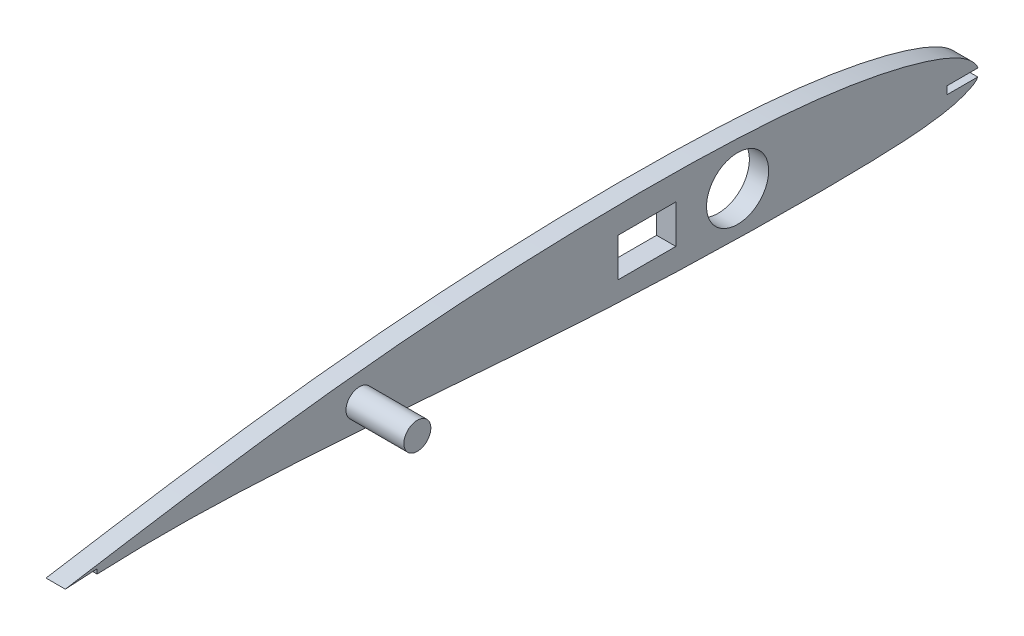
ISO-10303-21;
HEADER;
FILE_DESCRIPTION(('STEP AP214'),'2;1');
FILE_NAME('part.step','',(''),(''),'','','');
FILE_SCHEMA(('AUTOMOTIVE_DESIGN { 1 0 10303 214 1 1 1 1 }'));
ENDSEC;
DATA;
#1=APPLICATION_CONTEXT('core data for automotive mechanical design processes');
#2=APPLICATION_PROTOCOL_DEFINITION('international standard','automotive_design',2000,#1);
#3=PRODUCT_CONTEXT('',#1,'mechanical');
#4=PRODUCT('Part','Part','',(#3));
#5=PRODUCT_RELATED_PRODUCT_CATEGORY('part','',(#4));
#6=PRODUCT_DEFINITION_FORMATION('','',#4);
#7=PRODUCT_DEFINITION_CONTEXT('part definition',#1,'design');
#8=PRODUCT_DEFINITION('design','',#6,#7);
#9=PRODUCT_DEFINITION_SHAPE('','',#8);
#10=(LENGTH_UNIT() NAMED_UNIT(*) SI_UNIT(.MILLI.,.METRE.));
#11=(NAMED_UNIT(*) PLANE_ANGLE_UNIT() SI_UNIT($,.RADIAN.));
#12=(NAMED_UNIT(*) SI_UNIT($,.STERADIAN.) SOLID_ANGLE_UNIT());
#13=UNCERTAINTY_MEASURE_WITH_UNIT(LENGTH_MEASURE(1.E-05),#10,'distance_accuracy_value','');
#14=(GEOMETRIC_REPRESENTATION_CONTEXT(3) GLOBAL_UNCERTAINTY_ASSIGNED_CONTEXT((#13)) GLOBAL_UNIT_ASSIGNED_CONTEXT((#10,
#11,#12)) REPRESENTATION_CONTEXT('',''));
#15=CARTESIAN_POINT('',(0.,0.,0.));
#16=DIRECTION('',(0.,0.,1.));
#17=DIRECTION('',(1.,0.,0.));
#18=AXIS2_PLACEMENT_3D('',#15,#16,#17);
#19=CARTESIAN_POINT('',(5.,0.,250.));
#20=CARTESIAN_POINT('',(5.,-0.0080427959719715,250.000228293678));
#21=CARTESIAN_POINT('',(5.,0.172375657967406,248.284955515532));
#22=CARTESIAN_POINT('',(5.,0.308690014795419,246.518112419387));
#23=CARTESIAN_POINT('',(5.,0.685693593852336,242.189387343398));
#24=CARTESIAN_POINT('',(5.,1.07410152891603,236.806461263496));
#25=CARTESIAN_POINT('',(5.,1.49731723995003,229.680385951639));
#26=CARTESIAN_POINT('',(5.,1.8232186026768,221.18415869828));
#27=CARTESIAN_POINT('',(5.,1.96762610068065,211.337618207726));
#28=CARTESIAN_POINT('',(5.,1.83322105638369,200.371188527109));
#29=CARTESIAN_POINT('',(5.,1.38960528984164,188.499913622482));
#30=CARTESIAN_POINT('',(5.,0.706014078000893,175.953687417433));
#31=CARTESIAN_POINT('',(5.,-0.160208641561513,162.931424917666));
#32=CARTESIAN_POINT('',(5.,-1.14801632724376,149.615771743617));
#33=CARTESIAN_POINT('',(5.,-2.19092490983926,136.176354994724));
#34=CARTESIAN_POINT('',(5.,-3.21958397917046,122.767140548026));
#35=CARTESIAN_POINT('',(5.,-4.15274312671142,109.520053587455));
#36=CARTESIAN_POINT('',(5.,-4.93856436487493,96.5460959745437));
#37=CARTESIAN_POINT('',(5.,-5.53683070268675,83.9408193016427));
#38=CARTESIAN_POINT('',(5.,-5.94764820461108,71.8018392906514));
#39=CARTESIAN_POINT('',(5.,-6.21845093878312,60.2452560030716));
#40=CARTESIAN_POINT('',(5.,-6.35536975583973,49.3987328907547));
#41=CARTESIAN_POINT('',(5.,-6.38138796281789,39.3972261942655));
#42=CARTESIAN_POINT('',(5.,-6.26504923032313,30.3619348419668));
#43=CARTESIAN_POINT('',(5.,-6.01216491688521,22.4121811031587));
#44=CARTESIAN_POINT('',(5.,-5.59743390072595,15.6262272306516));
#45=CARTESIAN_POINT('',(5.,-4.92870657935606,10.0719075109048));
#46=CARTESIAN_POINT('',(5.,-4.04044698146404,5.69769261214423));
#47=CARTESIAN_POINT('',(5.,-2.8657529844069,2.62532063874475));
#48=CARTESIAN_POINT('',(5.,-1.7115284699546,0.494884225045661));
#49=CARTESIAN_POINT('',(5.,-0.410454230626488,-0.0213125491030087));
#50=CARTESIAN_POINT('',(5.,0.792659826704065,0.0311691995850224));
#51=CARTESIAN_POINT('',(5.,2.30568433693192,0.812599241892923));
#52=CARTESIAN_POINT('',(5.,4.23835242447377,2.72886351673443));
#53=CARTESIAN_POINT('',(5.,6.11817212106947,5.76990724125498));
#54=CARTESIAN_POINT('',(5.,7.91359420170391,9.88094280419771));
#55=CARTESIAN_POINT('',(5.,9.64131817838287,15.0749304677094));
#56=CARTESIAN_POINT('',(5.,11.2838964878058,21.2987522216172));
#57=CARTESIAN_POINT('',(5.,12.7883817585812,28.4971721202648));
#58=CARTESIAN_POINT('',(5.,14.0978349081275,36.6073734062479));
#59=CARTESIAN_POINT('',(5.,15.1594290171638,45.573028440303));
#60=CARTESIAN_POINT('',(5.,15.9609039979753,55.3329100744701));
#61=CARTESIAN_POINT('',(5.,16.4940697383882,65.8165364983871));
#62=CARTESIAN_POINT('',(5.,16.7919897051422,76.9313762604552));
#63=CARTESIAN_POINT('',(5.,16.864754130909,88.5669490281142));
#64=CARTESIAN_POINT('',(5.,16.7267152914356,100.596999885542));
#65=CARTESIAN_POINT('',(5.,16.3833850637257,112.888825982424));
#66=CARTESIAN_POINT('',(5.,15.825573666627,125.31161581915));
#67=CARTESIAN_POINT('',(5.,15.0523318700684,137.743791097076));
#68=CARTESIAN_POINT('',(5.,14.0593390742259,150.072384382085));
#69=CARTESIAN_POINT('',(5.,12.8815869860292,162.191375055682));
#70=CARTESIAN_POINT('',(5.,11.5492803460744,173.989074322246));
#71=CARTESIAN_POINT('',(5.,10.1162497290333,185.35236444642));
#72=CARTESIAN_POINT('',(5.,8.63237912523508,196.163081697706));
#73=CARTESIAN_POINT('',(5.,7.13151388385034,206.300441402258));
#74=CARTESIAN_POINT('',(5.,5.73122176805054,215.560350587015));
#75=CARTESIAN_POINT('',(5.,4.29329512716244,223.97715704258));
#76=CARTESIAN_POINT('',(5.,3.1818088737293,231.363413336396));
#77=CARTESIAN_POINT('',(5.,2.09894241729889,237.746440904332));
#78=CARTESIAN_POINT('',(5.,1.2458619166603,242.622069365861));
#79=CARTESIAN_POINT('',(5.,0.552864946230777,246.64452933247));
#80=CARTESIAN_POINT('',(5.,0.246216764640028,248.328398440367));
#81=CARTESIAN_POINT('',(5.,0.00797737724444139,249.999773563223));
#82=CARTESIAN_POINT('',(5.,0.,250.));
#83=B_SPLINE_CURVE_WITH_KNOTS('',3,(#19,#20,#21,#22,#23,#24,#25,#26,#27,#28,#29,#30,#31,#32,#33,
#34,#35,#36,#37,#38,#39,#40,#41,#42,#43,#44,#45,#46,#47,#48,#49,#50,#51,#52,#53,#54,#55,#56,#57,
#58,#59,#60,#61,#62,#63,#64,#65,#66,#67,#68,#69,#70,#71,#72,#73,#74,#75,#76,#77,#78,#79,#80,#81,
#82),.UNSPECIFIED.,.T.,.F.,(4,1,1,1,1,1,1,1,1,1,1,1,1,1,1,1,1,1,1,1,1,1,1,1,1,1,1,1,1,1,1,1,1,1,
1,1,1,1,1,1,1,1,1,1,1,1,1,1,1,1,1,1,1,1,1,1,1,1,1,1,1,4),(0.,0.00158888881614516,
0.00632921783555629,0.0142024564897436,0.0251728077530557,0.0391734833267743,0.0560606311759249,
0.0755789238487882,0.0973636066296903,0.120926258366677,0.145825281006277,0.171670911815127,
0.198108536705041,0.22479018357162,0.25139057978404,0.277643490654311,0.303326750051388,
0.328257458029316,0.352272548115194,0.375156061746876,0.396620664402003,0.416422729294005,
0.434304420097656,0.450054679859308,0.463465465082325,0.474478994238096,0.483169222153171,
0.489678354497499,0.494104066315722,0.496910015324886,0.497289784891853,0.501214273282496,
0.506457950332762,0.51335695674223,0.522168631834455,0.53296596992453,0.545689209241574,
0.56022077890382,0.57643892310517,0.594258689005965,0.613600244568652,0.634342385932902,
0.656331109263004,0.679351893859712,0.703152302846811,0.727478208080039,0.7520707394079,
0.776691163534608,0.801140183976245,0.825214386971546,0.848697423570622,0.871352857669295,
0.892947448931157,0.913230871058069,0.931955467148994,0.94834206907442,0.963693004275676,
0.976235918239566,0.986320058750392,0.993788799349345,0.998424034933867,1.),.UNSPECIFIED.);
#84=DIRECTION('',(-1.,0.,0.));
#85=VECTOR('',#84,1.);
#86=SURFACE_OF_LINEAR_EXTRUSION('',#83,#85);
#87=CARTESIAN_POINT('',(0.,0.,250.));
#88=CARTESIAN_POINT('',(0.,-0.0080427959719715,250.000228293678));
#89=CARTESIAN_POINT('',(0.,0.172375657967406,248.284955515532));
#90=CARTESIAN_POINT('',(0.,0.308690014795419,246.518112419387));
#91=CARTESIAN_POINT('',(0.,0.685693593852336,242.189387343398));
#92=CARTESIAN_POINT('',(0.,1.07410152891603,236.806461263496));
#93=CARTESIAN_POINT('',(0.,1.49731723995003,229.680385951639));
#94=CARTESIAN_POINT('',(0.,1.8232186026768,221.18415869828));
#95=CARTESIAN_POINT('',(0.,1.96762610068065,211.337618207726));
#96=CARTESIAN_POINT('',(0.,1.83322105638369,200.371188527109));
#97=CARTESIAN_POINT('',(0.,1.38960528984164,188.499913622482));
#98=CARTESIAN_POINT('',(0.,0.706014078000893,175.953687417433));
#99=CARTESIAN_POINT('',(0.,-0.160208641561513,162.931424917666));
#100=CARTESIAN_POINT('',(0.,-1.14801632724376,149.615771743617));
#101=CARTESIAN_POINT('',(0.,-2.19092490983926,136.176354994724));
#102=CARTESIAN_POINT('',(0.,-3.21958397917046,122.767140548026));
#103=CARTESIAN_POINT('',(0.,-4.15274312671142,109.520053587455));
#104=CARTESIAN_POINT('',(0.,-4.93856436487493,96.5460959745437));
#105=CARTESIAN_POINT('',(0.,-5.53683070268675,83.9408193016427));
#106=CARTESIAN_POINT('',(0.,-5.94764820461108,71.8018392906514));
#107=CARTESIAN_POINT('',(0.,-6.21845093878312,60.2452560030716));
#108=CARTESIAN_POINT('',(0.,-6.35536975583973,49.3987328907547));
#109=CARTESIAN_POINT('',(0.,-6.38138796281789,39.3972261942655));
#110=CARTESIAN_POINT('',(0.,-6.26504923032313,30.3619348419668));
#111=CARTESIAN_POINT('',(0.,-6.01216491688521,22.4121811031587));
#112=CARTESIAN_POINT('',(0.,-5.59743390072595,15.6262272306516));
#113=CARTESIAN_POINT('',(0.,-4.92870657935606,10.0719075109048));
#114=CARTESIAN_POINT('',(0.,-4.04044698146404,5.69769261214423));
#115=CARTESIAN_POINT('',(0.,-2.8657529844069,2.62532063874475));
#116=CARTESIAN_POINT('',(0.,-1.7115284699546,0.494884225045661));
#117=CARTESIAN_POINT('',(0.,-0.410454230626488,-0.0213125491030087));
#118=CARTESIAN_POINT('',(0.,0.792659826704065,0.0311691995850224));
#119=CARTESIAN_POINT('',(0.,2.30568433693192,0.812599241892923));
#120=CARTESIAN_POINT('',(0.,4.23835242447377,2.72886351673443));
#121=CARTESIAN_POINT('',(0.,6.11817212106947,5.76990724125498));
#122=CARTESIAN_POINT('',(0.,7.91359420170391,9.88094280419771));
#123=CARTESIAN_POINT('',(0.,9.64131817838287,15.0749304677094));
#124=CARTESIAN_POINT('',(0.,11.2838964878058,21.2987522216172));
#125=CARTESIAN_POINT('',(0.,12.7883817585812,28.4971721202648));
#126=CARTESIAN_POINT('',(0.,14.0978349081275,36.6073734062479));
#127=CARTESIAN_POINT('',(0.,15.1594290171638,45.573028440303));
#128=CARTESIAN_POINT('',(0.,15.9609039979753,55.3329100744701));
#129=CARTESIAN_POINT('',(0.,16.4940697383882,65.8165364983871));
#130=CARTESIAN_POINT('',(0.,16.7919897051422,76.9313762604552));
#131=CARTESIAN_POINT('',(0.,16.864754130909,88.5669490281142));
#132=CARTESIAN_POINT('',(0.,16.7267152914356,100.596999885542));
#133=CARTESIAN_POINT('',(0.,16.3833850637257,112.888825982424));
#134=CARTESIAN_POINT('',(0.,15.825573666627,125.31161581915));
#135=CARTESIAN_POINT('',(0.,15.0523318700684,137.743791097076));
#136=CARTESIAN_POINT('',(0.,14.0593390742259,150.072384382085));
#137=CARTESIAN_POINT('',(0.,12.8815869860292,162.191375055682));
#138=CARTESIAN_POINT('',(0.,11.5492803460744,173.989074322246));
#139=CARTESIAN_POINT('',(0.,10.1162497290333,185.35236444642));
#140=CARTESIAN_POINT('',(0.,8.63237912523508,196.163081697706));
#141=CARTESIAN_POINT('',(0.,7.13151388385034,206.300441402258));
#142=CARTESIAN_POINT('',(0.,5.73122176805054,215.560350587015));
#143=CARTESIAN_POINT('',(0.,4.29329512716244,223.97715704258));
#144=CARTESIAN_POINT('',(0.,3.1818088737293,231.363413336396));
#145=CARTESIAN_POINT('',(0.,2.09894241729889,237.746440904332));
#146=CARTESIAN_POINT('',(0.,1.2458619166603,242.622069365861));
#147=CARTESIAN_POINT('',(0.,0.552864946230777,246.64452933247));
#148=CARTESIAN_POINT('',(0.,0.246216764640028,248.328398440367));
#149=CARTESIAN_POINT('',(0.,0.00797737724443801,249.999773563223));
#150=CARTESIAN_POINT('',(0.,0.,250.));
#151=B_SPLINE_CURVE_WITH_KNOTS('',3,(#87,#88,#89,#90,#91,#92,#93,#94,#95,#96,#97,#98,#99,#100,
#101,#102,#103,#104,#105,#106,#107,#108,#109,#110,#111,#112,#113,#114,#115,#116,#117,#118,#119,
#120,#121,#122,#123,#124,#125,#126,#127,#128,#129,#130,#131,#132,#133,#134,#135,#136,#137,#138,
#139,#140,#141,#142,#143,#144,#145,#146,#147,#148,#149,#150),.UNSPECIFIED.,.T.,.F.,(4,1,1,1,1,1,
1,1,1,1,1,1,1,1,1,1,1,1,1,1,1,1,1,1,1,1,1,1,1,1,1,1,1,1,1,1,1,1,1,1,1,1,1,1,1,1,1,1,1,1,1,1,1,1,
1,1,1,1,1,1,1,4),(0.,0.00158888881614516,0.00632921783555629,0.0142024564897436,
0.0251728077530557,0.0391734833267743,0.0560606311759249,0.0755789238487882,0.0973636066296903,
0.120926258366677,0.145825281006277,0.171670911815127,0.198108536705041,0.22479018357162,
0.25139057978404,0.277643490654311,0.303326750051388,0.328257458029316,0.352272548115194,
0.375156061746876,0.396620664402003,0.416422729294005,0.434304420097656,0.450054679859308,
0.463465465082325,0.474478994238096,0.483169222153171,0.489678354497499,0.494104066315722,
0.496910015324886,0.497289784891853,0.501214273282496,0.506457950332762,0.51335695674223,
0.522168631834455,0.53296596992453,0.545689209241574,0.56022077890382,0.57643892310517,
0.594258689005965,0.613600244568652,0.634342385932902,0.656331109263004,0.679351893859712,
0.703152302846811,0.727478208080039,0.7520707394079,0.776691163534608,0.801140183976245,
0.825214386971546,0.848697423570622,0.871352857669295,0.892947448931157,0.913230871058069,
0.931955467148994,0.94834206907442,0.963693004275676,0.976235918239566,0.986320058750392,
0.993788799349345,0.998424034933867,1.),.UNSPECIFIED.);
#152=CARTESIAN_POINT('',(0.,0.999993477043925,0.201514144687533));
#153=VERTEX_POINT('',#152);
#154=CARTESIAN_POINT('',(0.,2.26814469716608,236.731303851277));
#155=VERTEX_POINT('',#154);
#156=EDGE_CURVE('E131',#153,#155,#151,.T.);
#157=ORIENTED_EDGE('',*,*,#156,.T.);
#158=DIRECTION('',(-1.,0.,0.));
#159=VECTOR('',#158,1.);
#160=CARTESIAN_POINT('',(5.,2.26814469832941,236.731303844473));
#161=LINE('',#160,#159);
#162=CARTESIAN_POINT('',(5.,2.26814469832942,236.731303844473));
#163=VERTEX_POINT('',#162);
#164=EDGE_CURVE('E41',#155,#163,#161,.F.);
#165=ORIENTED_EDGE('',*,*,#164,.T.);
#166=CARTESIAN_POINT('',(5.,0.999993477043937,0.201514159716749));
#167=VERTEX_POINT('',#166);
#168=EDGE_CURVE('E138',#167,#163,#83,.T.);
#169=ORIENTED_EDGE('',*,*,#168,.F.);
#170=DIRECTION('',(-1.,0.,0.));
#171=VECTOR('',#170,1.);
#172=CARTESIAN_POINT('',(5.,0.999993477043937,0.201514159716749));
#173=LINE('',#172,#171);
#174=EDGE_CURVE('E125',#167,#153,#173,.T.);
#175=ORIENTED_EDGE('',*,*,#174,.T.);
#176=EDGE_LOOP('',(#157,#165,#169,#175));
#177=FACE_BOUND('',#176,.T.);
#178=ADVANCED_FACE('F32',(#177),#86,.F.);
#179=CARTESIAN_POINT('',(5.,1.49711132773622,0.435092083404368));
#180=DIRECTION('',(-1.,0.,0.));
#181=DIRECTION('',(0.,0.,1.));
#182=AXIS2_PLACEMENT_3D('',#179,#180,#181);
#183=PLANE('',#182);
#184=CARTESIAN_POINT('',(5.,6.07732270373844,160.499919709394));
#185=DIRECTION('',(-1.,0.,0.));
#186=DIRECTION('',(0.,0.,1.));
#187=AXIS2_PLACEMENT_3D('',#184,#185,#186);
#188=CIRCLE('',#187,3.49999999999999);
#189=CARTESIAN_POINT('',(5.,6.07732270373844,163.999919709394));
#190=VERTEX_POINT('',#189);
#191=EDGE_CURVE('E176',#190,#190,#188,.T.);
#192=ORIENTED_EDGE('',*,*,#191,.T.);
#193=EDGE_LOOP('',(#192));
#194=FACE_BOUND('',#193,.T.);
#195=CARTESIAN_POINT('',(5.,5.07732270373844,62.4999197093942));
#196=DIRECTION('',(1.,0.,0.));
#197=DIRECTION('',(0.,0.,-1.));
#198=AXIS2_PLACEMENT_3D('',#195,#196,#197);
#199=CIRCLE('',#198,8.05);
#200=CARTESIAN_POINT('',(5.,5.07732270373844,54.4499197093942));
#201=VERTEX_POINT('',#200);
#202=EDGE_CURVE('E140',#201,#201,#199,.T.);
#203=ORIENTED_EDGE('',*,*,#202,.F.);
#204=EDGE_LOOP('',(#203));
#205=FACE_BOUND('',#204,.T.);
#206=DIRECTION('',(0.,0.0556361766390703,-0.998451108391886));
#207=VECTOR('',#206,1.);
#208=CARTESIAN_POINT('',(5.,15.3920131445867,1.20935053769156));
#209=LINE('',#208,#207);
#210=CARTESIAN_POINT('',(5.,2.72436134676977,228.544004755659));
#211=VERTEX_POINT('',#210);
#212=EDGE_CURVE('E48',#163,#211,#209,.T.);
#213=ORIENTED_EDGE('',*,*,#212,.T.);
#214=DIRECTION('',(0.,-0.998451108391885,-0.0556361766390853));
#215=VECTOR('',#214,1.);
#216=CARTESIAN_POINT('',(5.,-11.1705404700842,227.769746301372));
#217=LINE('',#216,#215);
#218=CARTESIAN_POINT('',(5.,1.5262200158208,228.477241363067));
#219=VERTEX_POINT('',#218);
#220=EDGE_CURVE('E367',#211,#219,#217,.T.);
#221=ORIENTED_EDGE('',*,*,#220,.T.);
#222=CARTESIAN_POINT('',(5.,-1.00000652295597,0.266538468505836));
#223=VERTEX_POINT('',#222);
#224=EDGE_CURVE('E56',#219,#223,#83,.T.);
#225=ORIENTED_EDGE('',*,*,#224,.T.);
#226=DIRECTION('',(0.,0.,1.));
#227=VECTOR('',#226,1.);
#228=CARTESIAN_POINT('',(5.,-1.00000652295607,0.435092083404368));
#229=LINE('',#228,#227);
#230=CARTESIAN_POINT('',(5.,-1.00000652295607,8.19991970488098));
#231=VERTEX_POINT('',#230);
#232=EDGE_CURVE('E166',#223,#231,#229,.T.);
#233=ORIENTED_EDGE('',*,*,#232,.T.);
#234=DIRECTION('',(0.,1.,0.));
#235=VECTOR('',#234,1.);
#236=CARTESIAN_POINT('',(5.,1.49711132773622,8.19991970488098));
#237=LINE('',#236,#235);
#238=CARTESIAN_POINT('',(5.,0.99999347704393,8.19991970488098));
#239=VERTEX_POINT('',#238);
#240=EDGE_CURVE('E163',#231,#239,#237,.T.);
#241=ORIENTED_EDGE('',*,*,#240,.T.);
#242=DIRECTION('',(0.,0.,-1.));
#243=VECTOR('',#242,1.);
#244=CARTESIAN_POINT('',(5.,0.999993477043925,0.435092083404369));
#245=LINE('',#244,#243);
#246=EDGE_CURVE('E162',#239,#167,#245,.T.);
#247=ORIENTED_EDGE('',*,*,#246,.T.);
#248=ORIENTED_EDGE('',*,*,#168,.T.);
#249=EDGE_LOOP('',(#213,#221,#225,#233,#241,#247,#248));
#250=FACE_BOUND('',#249,.T.);
#251=DIRECTION('',(0.,1.,0.));
#252=VECTOR('',#251,1.);
#253=CARTESIAN_POINT('',(5.,10.0773227037384,78.4999197093942));
#254=LINE('',#253,#252);
#255=CARTESIAN_POINT('',(5.,0.0773227037384437,78.4999197093942));
#256=VERTEX_POINT('',#255);
#257=CARTESIAN_POINT('',(5.,10.0773227037384,78.4999197093942));
#258=VERTEX_POINT('',#257);
#259=EDGE_CURVE('E180',#256,#258,#254,.T.);
#260=ORIENTED_EDGE('',*,*,#259,.F.);
#261=DIRECTION('',(0.,0.,-1.));
#262=VECTOR('',#261,1.);
#263=CARTESIAN_POINT('',(5.,0.0773227037384437,78.4999197093942));
#264=LINE('',#263,#262);
#265=CARTESIAN_POINT('',(5.,0.0773227037384437,93.4999197093942));
#266=VERTEX_POINT('',#265);
#267=EDGE_CURVE('E188',#266,#256,#264,.T.);
#268=ORIENTED_EDGE('',*,*,#267,.F.);
#269=DIRECTION('',(0.,-1.,0.));
#270=VECTOR('',#269,1.);
#271=CARTESIAN_POINT('',(5.,10.0773227037384,93.4999197093942));
#272=LINE('',#271,#270);
#273=CARTESIAN_POINT('',(5.,10.0773227037384,93.4999197093942));
#274=VERTEX_POINT('',#273);
#275=EDGE_CURVE('E185',#274,#266,#272,.T.);
#276=ORIENTED_EDGE('',*,*,#275,.F.);
#277=DIRECTION('',(0.,0.,1.));
#278=VECTOR('',#277,1.);
#279=CARTESIAN_POINT('',(5.,10.0773227037384,78.4999197093942));
#280=LINE('',#279,#278);
#281=EDGE_CURVE('E182',#258,#274,#280,.T.);
#282=ORIENTED_EDGE('',*,*,#281,.F.);
#283=EDGE_LOOP('',(#260,#268,#276,#282));
#284=FACE_BOUND('',#283,.T.);
#285=ADVANCED_FACE('F159',(#194,#205,#250,#284),#183,.F.);
#286=CARTESIAN_POINT('',(0.,1.49711132773622,0.435092083404368));
#287=DIRECTION('',(-1.,0.,0.));
#288=DIRECTION('',(0.,0.,1.));
#289=AXIS2_PLACEMENT_3D('',#286,#287,#288);
#290=PLANE('',#289);
#291=DIRECTION('',(0.,-0.998451108391886,-0.0556361766390853));
#292=VECTOR('',#291,1.);
#293=CARTESIAN_POINT('',(0.,-12.6871870293484,227.685234986635));
#294=LINE('',#293,#292);
#295=CARTESIAN_POINT('',(0.,2.72436134676977,228.544004755659));
#296=VERTEX_POINT('',#295);
#297=CARTESIAN_POINT('',(0.,1.5262200158208,228.477241363067));
#298=VERTEX_POINT('',#297);
#299=EDGE_CURVE('E133',#296,#298,#294,.T.);
#300=ORIENTED_EDGE('',*,*,#299,.F.);
#301=DIRECTION('',(0.,0.0556361766390703,-0.998451108391886));
#302=VECTOR('',#301,1.);
#303=CARTESIAN_POINT('',(0.,15.4115483761148,0.858769769023641));
#304=LINE('',#303,#302);
#305=EDGE_CURVE('E119',#155,#296,#304,.T.);
#306=ORIENTED_EDGE('',*,*,#305,.F.);
#307=ORIENTED_EDGE('',*,*,#156,.F.);
#308=DIRECTION('',(0.,0.,-1.));
#309=VECTOR('',#308,1.);
#310=CARTESIAN_POINT('',(0.,0.999993477043925,-8.02951190164796E-05));
#311=LINE('',#310,#309);
#312=CARTESIAN_POINT('',(0.,0.99999347704393,8.19991970488098));
#313=VERTEX_POINT('',#312);
#314=EDGE_CURVE('E379',#313,#153,#311,.T.);
#315=ORIENTED_EDGE('',*,*,#314,.F.);
#316=DIRECTION('',(0.,1.,0.));
#317=VECTOR('',#316,1.);
#318=CARTESIAN_POINT('',(0.,0.99999347704393,8.19991970488098));
#319=LINE('',#318,#317);
#320=CARTESIAN_POINT('',(0.,-1.00000652295607,8.19991970488098));
#321=VERTEX_POINT('',#320);
#322=EDGE_CURVE('E376',#321,#313,#319,.T.);
#323=ORIENTED_EDGE('',*,*,#322,.F.);
#324=DIRECTION('',(0.,0.,1.));
#325=VECTOR('',#324,1.);
#326=CARTESIAN_POINT('',(0.,-1.00000652295607,-8.02951190158673E-05));
#327=LINE('',#326,#325);
#328=CARTESIAN_POINT('',(0.,-1.00000652295607,0.266538474914019));
#329=VERTEX_POINT('',#328);
#330=EDGE_CURVE('E373',#329,#321,#327,.T.);
#331=ORIENTED_EDGE('',*,*,#330,.F.);
#332=EDGE_CURVE('E136',#298,#329,#151,.T.);
#333=ORIENTED_EDGE('',*,*,#332,.F.);
#334=EDGE_LOOP('',(#300,#306,#307,#315,#323,#331,#333));
#335=FACE_BOUND('',#334,.T.);
#336=CARTESIAN_POINT('',(0.,5.07732270373844,62.4999197093942));
#337=DIRECTION('',(1.,0.,0.));
#338=DIRECTION('',(0.,0.,-1.));
#339=AXIS2_PLACEMENT_3D('',#336,#337,#338);
#340=CIRCLE('',#339,8.05);
#341=CARTESIAN_POINT('',(0.,5.07732270373844,54.4499197093942));
#342=VERTEX_POINT('',#341);
#343=EDGE_CURVE('E210',#342,#342,#340,.T.);
#344=ORIENTED_EDGE('',*,*,#343,.T.);
#345=EDGE_LOOP('',(#344));
#346=FACE_BOUND('',#345,.T.);
#347=DIRECTION('',(0.,0.,-1.));
#348=VECTOR('',#347,1.);
#349=CARTESIAN_POINT('',(0.,0.0773227037384437,78.4999197093942));
#350=LINE('',#349,#348);
#351=CARTESIAN_POINT('',(0.,0.0773227037384437,93.4999197093942));
#352=VERTEX_POINT('',#351);
#353=CARTESIAN_POINT('',(0.,0.0773227037384437,78.4999197093942));
#354=VERTEX_POINT('',#353);
#355=EDGE_CURVE('E183',#352,#354,#350,.T.);
#356=ORIENTED_EDGE('',*,*,#355,.T.);
#357=DIRECTION('',(0.,1.,0.));
#358=VECTOR('',#357,1.);
#359=CARTESIAN_POINT('',(0.,10.0773227037384,78.4999197093942));
#360=LINE('',#359,#358);
#361=CARTESIAN_POINT('',(0.,10.0773227037384,78.4999197093942));
#362=VERTEX_POINT('',#361);
#363=EDGE_CURVE('E179',#354,#362,#360,.T.);
#364=ORIENTED_EDGE('',*,*,#363,.T.);
#365=DIRECTION('',(0.,0.,1.));
#366=VECTOR('',#365,1.);
#367=CARTESIAN_POINT('',(0.,10.0773227037384,78.4999197093942));
#368=LINE('',#367,#366);
#369=CARTESIAN_POINT('',(0.,10.0773227037384,93.4999197093942));
#370=VERTEX_POINT('',#369);
#371=EDGE_CURVE('E193',#362,#370,#368,.T.);
#372=ORIENTED_EDGE('',*,*,#371,.T.);
#373=DIRECTION('',(0.,-1.,0.));
#374=VECTOR('',#373,1.);
#375=CARTESIAN_POINT('',(0.,10.0773227037384,93.4999197093942));
#376=LINE('',#375,#374);
#377=EDGE_CURVE('E196',#370,#352,#376,.T.);
#378=ORIENTED_EDGE('',*,*,#377,.T.);
#379=EDGE_LOOP('',(#356,#364,#372,#378));
#380=FACE_BOUND('',#379,.T.);
#381=ADVANCED_FACE('F128',(#335,#346,#380),#290,.T.);
#382=ORIENTED_EDGE('',*,*,#224,.F.);
#383=DIRECTION('',(-1.,0.,0.));
#384=VECTOR('',#383,1.);
#385=CARTESIAN_POINT('',(5.,1.52622001669951,228.477241343692));
#386=LINE('',#385,#384);
#387=EDGE_CURVE('E11',#219,#298,#386,.T.);
#388=ORIENTED_EDGE('',*,*,#387,.T.);
#389=ORIENTED_EDGE('',*,*,#332,.T.);
#390=DIRECTION('',(-1.,0.,0.));
#391=VECTOR('',#390,1.);
#392=CARTESIAN_POINT('',(5.,-1.00000652295608,0.26653846850589));
#393=LINE('',#392,#391);
#394=EDGE_CURVE('E150',#329,#223,#393,.F.);
#395=ORIENTED_EDGE('',*,*,#394,.T.);
#396=EDGE_LOOP('',(#382,#388,#389,#395));
#397=FACE_BOUND('',#396,.T.);
#398=ADVANCED_FACE('F34',(#397),#86,.F.);
#399=CARTESIAN_POINT('',(5.,5.07732270373844,62.4999197093942));
#400=DIRECTION('',(-1.,0.,0.));
#401=DIRECTION('',(0.,0.,1.));
#402=AXIS2_PLACEMENT_3D('',#399,#400,#401);
#403=CYLINDRICAL_SURFACE('',#402,8.05);
#404=ORIENTED_EDGE('',*,*,#202,.T.);
#405=EDGE_LOOP('',(#404));
#406=FACE_BOUND('',#405,.T.);
#407=ORIENTED_EDGE('',*,*,#343,.F.);
#408=EDGE_LOOP('',(#407));
#409=FACE_BOUND('',#408,.T.);
#410=ADVANCED_FACE('F216',(#406,#409),#403,.F.);
#411=CARTESIAN_POINT('',(5.,10.0773227037384,78.4999197093942));
#412=DIRECTION('',(0.,0.,1.));
#413=DIRECTION('',(1.,0.,0.));
#414=AXIS2_PLACEMENT_3D('',#411,#412,#413);
#415=PLANE('',#414);
#416=ORIENTED_EDGE('',*,*,#363,.F.);
#417=DIRECTION('',(-1.,0.,0.));
#418=VECTOR('',#417,1.);
#419=CARTESIAN_POINT('',(5.,0.0773227037384437,78.4999197093942));
#420=LINE('',#419,#418);
#421=EDGE_CURVE('E190',#256,#354,#420,.T.);
#422=ORIENTED_EDGE('',*,*,#421,.F.);
#423=ORIENTED_EDGE('',*,*,#259,.T.);
#424=DIRECTION('',(-1.,0.,0.));
#425=VECTOR('',#424,1.);
#426=CARTESIAN_POINT('',(5.,10.0773227037384,78.4999197093942));
#427=LINE('',#426,#425);
#428=EDGE_CURVE('E207',#258,#362,#427,.T.);
#429=ORIENTED_EDGE('',*,*,#428,.T.);
#430=EDGE_LOOP('',(#416,#422,#423,#429));
#431=FACE_BOUND('',#430,.T.);
#432=ADVANCED_FACE('F218',(#431),#415,.T.);
#433=CARTESIAN_POINT('',(5.,10.0773227037384,78.4999197093942));
#434=DIRECTION('',(0.,-1.,0.));
#435=DIRECTION('',(0.,0.,-1.));
#436=AXIS2_PLACEMENT_3D('',#433,#434,#435);
#437=PLANE('',#436);
#438=ORIENTED_EDGE('',*,*,#371,.F.);
#439=ORIENTED_EDGE('',*,*,#428,.F.);
#440=ORIENTED_EDGE('',*,*,#281,.T.);
#441=DIRECTION('',(-1.,0.,0.));
#442=VECTOR('',#441,1.);
#443=CARTESIAN_POINT('',(5.,10.0773227037384,93.4999197093942));
#444=LINE('',#443,#442);
#445=EDGE_CURVE('E205',#274,#370,#444,.T.);
#446=ORIENTED_EDGE('',*,*,#445,.T.);
#447=EDGE_LOOP('',(#438,#439,#440,#446));
#448=FACE_BOUND('',#447,.T.);
#449=ADVANCED_FACE('F225',(#448),#437,.T.);
#450=CARTESIAN_POINT('',(5.,10.0773227037384,93.4999197093942));
#451=DIRECTION('',(0.,0.,-1.));
#452=DIRECTION('',(-1.,0.,0.));
#453=AXIS2_PLACEMENT_3D('',#450,#451,#452);
#454=PLANE('',#453);
#455=ORIENTED_EDGE('',*,*,#377,.F.);
#456=ORIENTED_EDGE('',*,*,#445,.F.);
#457=ORIENTED_EDGE('',*,*,#275,.T.);
#458=DIRECTION('',(-1.,0.,0.));
#459=VECTOR('',#458,1.);
#460=CARTESIAN_POINT('',(5.,0.0773227037384437,93.4999197093942));
#461=LINE('',#460,#459);
#462=EDGE_CURVE('E203',#266,#352,#461,.T.);
#463=ORIENTED_EDGE('',*,*,#462,.T.);
#464=EDGE_LOOP('',(#455,#456,#457,#463));
#465=FACE_BOUND('',#464,.T.);
#466=ADVANCED_FACE('F254',(#465),#454,.T.);
#467=CARTESIAN_POINT('',(5.,0.0773227037384437,78.4999197093942));
#468=DIRECTION('',(0.,1.,0.));
#469=DIRECTION('',(0.,0.,1.));
#470=AXIS2_PLACEMENT_3D('',#467,#468,#469);
#471=PLANE('',#470);
#472=ORIENTED_EDGE('',*,*,#355,.F.);
#473=ORIENTED_EDGE('',*,*,#462,.F.);
#474=ORIENTED_EDGE('',*,*,#267,.T.);
#475=ORIENTED_EDGE('',*,*,#421,.T.);
#476=EDGE_LOOP('',(#472,#473,#474,#475));
#477=FACE_BOUND('',#476,.T.);
#478=ADVANCED_FACE('F244',(#477),#471,.T.);
#479=CARTESIAN_POINT('',(20.,6.07732270373844,160.499919709394));
#480=DIRECTION('',(-1.,0.,0.));
#481=DIRECTION('',(0.,0.,1.));
#482=AXIS2_PLACEMENT_3D('',#479,#480,#481);
#483=CYLINDRICAL_SURFACE('',#482,3.49999999999999);
#484=CARTESIAN_POINT('',(20.,6.07732270373844,160.499919709394));
#485=DIRECTION('',(-1.,0.,0.));
#486=DIRECTION('',(0.,0.,1.));
#487=AXIS2_PLACEMENT_3D('',#484,#485,#486);
#488=CIRCLE('',#487,3.49999999999999);
#489=CARTESIAN_POINT('',(20.,6.07732270373844,163.999919709394));
#490=VERTEX_POINT('',#489);
#491=EDGE_CURVE('E168',#490,#490,#488,.T.);
#492=ORIENTED_EDGE('',*,*,#491,.T.);
#493=EDGE_LOOP('',(#492));
#494=FACE_BOUND('',#493,.T.);
#495=ORIENTED_EDGE('',*,*,#191,.F.);
#496=EDGE_LOOP('',(#495));
#497=FACE_BOUND('',#496,.T.);
#498=ADVANCED_FACE('F241',(#494,#497),#483,.T.);
#499=CARTESIAN_POINT('',(20.,6.07732270373844,160.499919709394));
#500=DIRECTION('',(-1.,0.,0.));
#501=DIRECTION('',(0.,0.,1.));
#502=AXIS2_PLACEMENT_3D('',#499,#500,#501);
#503=PLANE('',#502);
#504=ORIENTED_EDGE('',*,*,#491,.F.);
#505=EDGE_LOOP('',(#504));
#506=FACE_BOUND('',#505,.T.);
#507=ADVANCED_FACE('F243',(#506),#503,.F.);
#508=CARTESIAN_POINT('',(20.,0.99999347704393,8.19991970488098));
#509=DIRECTION('',(0.,0.,1.));
#510=DIRECTION('',(0.,-1.,0.));
#511=AXIS2_PLACEMENT_3D('',#508,#509,#510);
#512=PLANE('',#511);
#513=DIRECTION('',(-1.,0.,0.));
#514=VECTOR('',#513,1.);
#515=CARTESIAN_POINT('',(20.,-1.00000652295607,8.19991970488098));
#516=LINE('',#515,#514);
#517=EDGE_CURVE('E381',#231,#321,#516,.T.);
#518=ORIENTED_EDGE('',*,*,#517,.T.);
#519=ORIENTED_EDGE('',*,*,#322,.T.);
#520=DIRECTION('',(-1.,0.,0.));
#521=VECTOR('',#520,1.);
#522=CARTESIAN_POINT('',(20.,0.99999347704393,8.19991970488098));
#523=LINE('',#522,#521);
#524=EDGE_CURVE('E170',#239,#313,#523,.T.);
#525=ORIENTED_EDGE('',*,*,#524,.F.);
#526=ORIENTED_EDGE('',*,*,#240,.F.);
#527=EDGE_LOOP('',(#518,#519,#525,#526));
#528=FACE_BOUND('',#527,.T.);
#529=ADVANCED_FACE('F251',(#528),#512,.F.);
#530=CARTESIAN_POINT('',(20.,0.999993477043925,-8.02951190164796E-05));
#531=DIRECTION('',(0.,1.,0.));
#532=DIRECTION('',(0.,0.,1.));
#533=AXIS2_PLACEMENT_3D('',#530,#531,#532);
#534=PLANE('',#533);
#535=ORIENTED_EDGE('',*,*,#524,.T.);
#536=ORIENTED_EDGE('',*,*,#314,.T.);
#537=ORIENTED_EDGE('',*,*,#174,.F.);
#538=ORIENTED_EDGE('',*,*,#246,.F.);
#539=EDGE_LOOP('',(#535,#536,#537,#538));
#540=FACE_BOUND('',#539,.T.);
#541=ADVANCED_FACE('F305',(#540),#534,.F.);
#542=CARTESIAN_POINT('',(20.,-1.00000652295607,-8.02951190158673E-05));
#543=DIRECTION('',(0.,-1.,0.));
#544=DIRECTION('',(0.,0.,-1.));
#545=AXIS2_PLACEMENT_3D('',#542,#543,#544);
#546=PLANE('',#545);
#547=ORIENTED_EDGE('',*,*,#394,.F.);
#548=ORIENTED_EDGE('',*,*,#330,.T.);
#549=ORIENTED_EDGE('',*,*,#517,.F.);
#550=ORIENTED_EDGE('',*,*,#232,.F.);
#551=EDGE_LOOP('',(#547,#548,#549,#550));
#552=FACE_BOUND('',#551,.T.);
#553=ADVANCED_FACE('F315',(#552),#546,.F.);
#554=CARTESIAN_POINT('',(20.,-12.6871870293484,227.685234986635));
#555=DIRECTION('',(0.,0.0556361766390853,-0.998451108391885));
#556=DIRECTION('',(0.,0.998451108391885,0.0556361766390853));
#557=AXIS2_PLACEMENT_3D('',#554,#555,#556);
#558=PLANE('',#557);
#559=DIRECTION('',(-1.,0.,0.));
#560=VECTOR('',#559,1.);
#561=CARTESIAN_POINT('',(20.,2.72436134676977,228.544004755659));
#562=LINE('',#561,#560);
#563=EDGE_CURVE('E366',#211,#296,#562,.T.);
#564=ORIENTED_EDGE('',*,*,#563,.T.);
#565=ORIENTED_EDGE('',*,*,#299,.T.);
#566=ORIENTED_EDGE('',*,*,#387,.F.);
#567=ORIENTED_EDGE('',*,*,#220,.F.);
#568=EDGE_LOOP('',(#564,#565,#566,#567));
#569=FACE_BOUND('',#568,.T.);
#570=ADVANCED_FACE('F323',(#569),#558,.F.);
#571=CARTESIAN_POINT('',(20.,15.4115483761148,0.858769769023641));
#572=DIRECTION('',(0.,0.998451108391886,0.0556361766390703));
#573=DIRECTION('',(0.,-0.0556361766390703,0.998451108391886));
#574=AXIS2_PLACEMENT_3D('',#571,#572,#573);
#575=PLANE('',#574);
#576=ORIENTED_EDGE('',*,*,#164,.F.);
#577=ORIENTED_EDGE('',*,*,#305,.T.);
#578=ORIENTED_EDGE('',*,*,#563,.F.);
#579=ORIENTED_EDGE('',*,*,#212,.F.);
#580=EDGE_LOOP('',(#576,#577,#578,#579));
#581=FACE_BOUND('',#580,.T.);
#582=ADVANCED_FACE('F118',(#581),#575,.F.);
#583=CLOSED_SHELL('',(#178,#285,#381,#398,#410,#432,#449,#466,#478,#498,#507,#529,#541,#553,
#570,#582));
#584=MANIFOLD_SOLID_BREP('B2',#583);
#585=ADVANCED_BREP_SHAPE_REPRESENTATION('',(#18,#584),#14);
#586=SHAPE_DEFINITION_REPRESENTATION(#9,#585);
ENDSEC;
END-ISO-10303-21;
